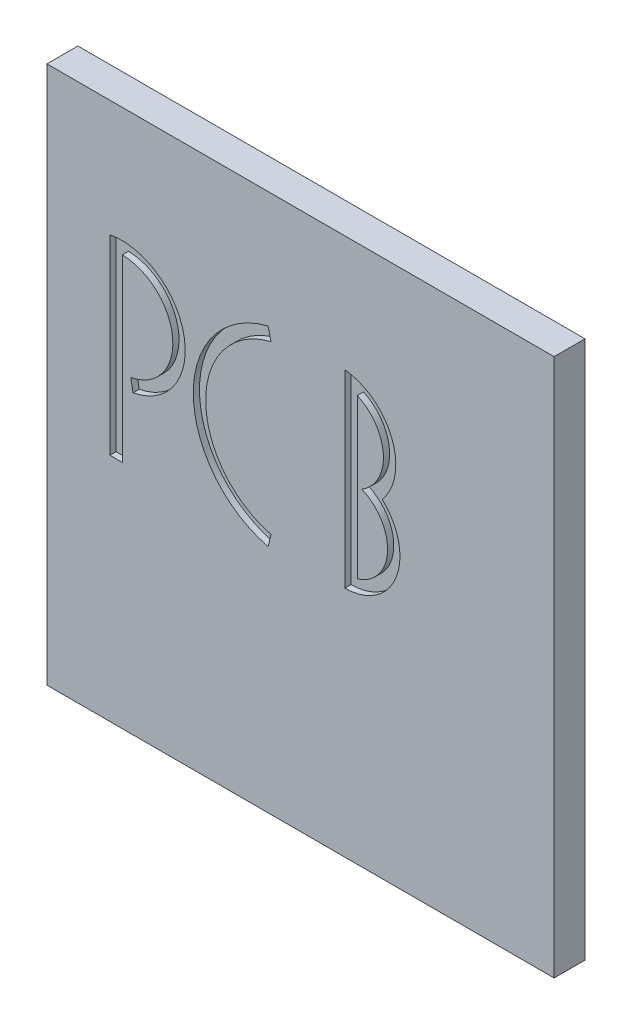
ISO-10303-21;
HEADER;
FILE_DESCRIPTION(('STEP AP214'),'2;1');
FILE_NAME('part.step','',(''),(''),'','','');
FILE_SCHEMA(('AUTOMOTIVE_DESIGN { 1 0 10303 214 1 1 1 1 }'));
ENDSEC;
DATA;
#1=APPLICATION_CONTEXT('core data for automotive mechanical design processes');
#2=APPLICATION_PROTOCOL_DEFINITION('international standard','automotive_design',2000,#1);
#3=PRODUCT_CONTEXT('',#1,'mechanical');
#4=PRODUCT('Part','Part','',(#3));
#5=PRODUCT_RELATED_PRODUCT_CATEGORY('part','',(#4));
#6=PRODUCT_DEFINITION_FORMATION('','',#4);
#7=PRODUCT_DEFINITION_CONTEXT('part definition',#1,'design');
#8=PRODUCT_DEFINITION('design','',#6,#7);
#9=PRODUCT_DEFINITION_SHAPE('','',#8);
#10=(LENGTH_UNIT() NAMED_UNIT(*) SI_UNIT(.MILLI.,.METRE.));
#11=(NAMED_UNIT(*) PLANE_ANGLE_UNIT() SI_UNIT($,.RADIAN.));
#12=(NAMED_UNIT(*) SI_UNIT($,.STERADIAN.) SOLID_ANGLE_UNIT());
#13=UNCERTAINTY_MEASURE_WITH_UNIT(LENGTH_MEASURE(1.E-05),#10,'distance_accuracy_value','');
#14=(GEOMETRIC_REPRESENTATION_CONTEXT(3) GLOBAL_UNCERTAINTY_ASSIGNED_CONTEXT((#13)) GLOBAL_UNIT_ASSIGNED_CONTEXT((#10,
#11,#12)) REPRESENTATION_CONTEXT('',''));
#15=CARTESIAN_POINT('',(0.,0.,0.));
#16=DIRECTION('',(0.,0.,1.));
#17=DIRECTION('',(1.,0.,0.));
#18=AXIS2_PLACEMENT_3D('',#15,#16,#17);
#19=CARTESIAN_POINT('',(-41.,43.5,5.));
#20=DIRECTION('',(1.,0.,0.));
#21=DIRECTION('',(0.,1.,0.));
#22=AXIS2_PLACEMENT_3D('',#19,#20,#21);
#23=PLANE('',#22);
#24=DIRECTION('',(0.,-1.,0.));
#25=VECTOR('',#24,1.);
#26=CARTESIAN_POINT('',(-41.,43.5,0.));
#27=LINE('',#26,#25);
#28=CARTESIAN_POINT('',(-41.,43.5,0.));
#29=VERTEX_POINT('',#28);
#30=CARTESIAN_POINT('',(-41.,-43.5,0.));
#31=VERTEX_POINT('',#30);
#32=EDGE_CURVE('E217',#29,#31,#27,.T.);
#33=ORIENTED_EDGE('',*,*,#32,.T.);
#34=DIRECTION('',(0.,0.,-1.));
#35=VECTOR('',#34,1.);
#36=CARTESIAN_POINT('',(-41.,-43.5,5.));
#37=LINE('',#36,#35);
#38=CARTESIAN_POINT('',(-41.,-43.5,5.));
#39=VERTEX_POINT('',#38);
#40=EDGE_CURVE('E11',#39,#31,#37,.T.);
#41=ORIENTED_EDGE('',*,*,#40,.F.);
#42=DIRECTION('',(0.,-1.,0.));
#43=VECTOR('',#42,1.);
#44=CARTESIAN_POINT('',(-41.,43.5,5.));
#45=LINE('',#44,#43);
#46=CARTESIAN_POINT('',(-41.,43.5,5.));
#47=VERTEX_POINT('',#46);
#48=EDGE_CURVE('E303',#47,#39,#45,.T.);
#49=ORIENTED_EDGE('',*,*,#48,.F.);
#50=DIRECTION('',(0.,0.,-1.));
#51=VECTOR('',#50,1.);
#52=CARTESIAN_POINT('',(-41.,43.5,5.));
#53=LINE('',#52,#51);
#54=EDGE_CURVE('E313',#47,#29,#53,.T.);
#55=ORIENTED_EDGE('',*,*,#54,.T.);
#56=EDGE_LOOP('',(#33,#41,#49,#55));
#57=FACE_BOUND('',#56,.T.);
#58=ADVANCED_FACE('F33',(#57),#23,.F.);
#59=CARTESIAN_POINT('',(41.,-43.5,5.));
#60=DIRECTION('',(0.,1.,0.));
#61=DIRECTION('',(0.,0.,1.));
#62=AXIS2_PLACEMENT_3D('',#59,#60,#61);
#63=PLANE('',#62);
#64=DIRECTION('',(1.,0.,0.));
#65=VECTOR('',#64,1.);
#66=CARTESIAN_POINT('',(41.,-43.5,0.));
#67=LINE('',#66,#65);
#68=CARTESIAN_POINT('',(41.,-43.5,0.));
#69=VERTEX_POINT('',#68);
#70=EDGE_CURVE('E316',#31,#69,#67,.T.);
#71=ORIENTED_EDGE('',*,*,#70,.T.);
#72=DIRECTION('',(0.,0.,-1.));
#73=VECTOR('',#72,1.);
#74=CARTESIAN_POINT('',(41.,-43.5,5.));
#75=LINE('',#74,#73);
#76=CARTESIAN_POINT('',(41.,-43.5,5.));
#77=VERTEX_POINT('',#76);
#78=EDGE_CURVE('E40',#77,#69,#75,.T.);
#79=ORIENTED_EDGE('',*,*,#78,.F.);
#80=DIRECTION('',(1.,0.,0.));
#81=VECTOR('',#80,1.);
#82=CARTESIAN_POINT('',(41.,-43.5,5.));
#83=LINE('',#82,#81);
#84=EDGE_CURVE('E306',#39,#77,#83,.T.);
#85=ORIENTED_EDGE('',*,*,#84,.F.);
#86=ORIENTED_EDGE('',*,*,#40,.T.);
#87=EDGE_LOOP('',(#71,#79,#85,#86));
#88=FACE_BOUND('',#87,.T.);
#89=ADVANCED_FACE('F346',(#88),#63,.F.);
#90=CARTESIAN_POINT('',(41.,43.5,5.));
#91=DIRECTION('',(-1.,0.,0.));
#92=DIRECTION('',(0.,-1.,0.));
#93=AXIS2_PLACEMENT_3D('',#90,#91,#92);
#94=PLANE('',#93);
#95=DIRECTION('',(0.,1.,0.));
#96=VECTOR('',#95,1.);
#97=CARTESIAN_POINT('',(41.,43.5,0.));
#98=LINE('',#97,#96);
#99=CARTESIAN_POINT('',(41.,43.5,0.));
#100=VERTEX_POINT('',#99);
#101=EDGE_CURVE('E318',#69,#100,#98,.T.);
#102=ORIENTED_EDGE('',*,*,#101,.T.);
#103=DIRECTION('',(0.,0.,-1.));
#104=VECTOR('',#103,1.);
#105=CARTESIAN_POINT('',(41.,43.5,5.));
#106=LINE('',#105,#104);
#107=CARTESIAN_POINT('',(41.,43.5,5.));
#108=VERTEX_POINT('',#107);
#109=EDGE_CURVE('E323',#108,#100,#106,.T.);
#110=ORIENTED_EDGE('',*,*,#109,.F.);
#111=DIRECTION('',(0.,1.,0.));
#112=VECTOR('',#111,1.);
#113=CARTESIAN_POINT('',(41.,43.5,5.));
#114=LINE('',#113,#112);
#115=EDGE_CURVE('E309',#77,#108,#114,.T.);
#116=ORIENTED_EDGE('',*,*,#115,.F.);
#117=ORIENTED_EDGE('',*,*,#78,.T.);
#118=EDGE_LOOP('',(#102,#110,#116,#117));
#119=FACE_BOUND('',#118,.T.);
#120=ADVANCED_FACE('F330',(#119),#94,.F.);
#121=CARTESIAN_POINT('',(41.,43.5,5.));
#122=DIRECTION('',(0.,-1.,0.));
#123=DIRECTION('',(1.,0.,0.));
#124=AXIS2_PLACEMENT_3D('',#121,#122,#123);
#125=PLANE('',#124);
#126=DIRECTION('',(-1.,0.,0.));
#127=VECTOR('',#126,1.);
#128=CARTESIAN_POINT('',(41.,43.5,0.));
#129=LINE('',#128,#127);
#130=EDGE_CURVE('E307',#100,#29,#129,.T.);
#131=ORIENTED_EDGE('',*,*,#130,.T.);
#132=ORIENTED_EDGE('',*,*,#54,.F.);
#133=DIRECTION('',(-1.,0.,0.));
#134=VECTOR('',#133,1.);
#135=CARTESIAN_POINT('',(41.,43.5,5.));
#136=LINE('',#135,#134);
#137=EDGE_CURVE('E311',#108,#47,#136,.T.);
#138=ORIENTED_EDGE('',*,*,#137,.F.);
#139=ORIENTED_EDGE('',*,*,#109,.T.);
#140=EDGE_LOOP('',(#131,#132,#138,#139));
#141=FACE_BOUND('',#140,.T.);
#142=ADVANCED_FACE('F339',(#141),#125,.F.);
#143=CARTESIAN_POINT('',(0.,0.,5.));
#144=DIRECTION('',(0.,0.,-1.));
#145=DIRECTION('',(-1.,0.,0.));
#146=AXIS2_PLACEMENT_3D('',#143,#144,#145);
#147=PLANE('',#146);
#148=DIRECTION('',(0.,-1.,0.));
#149=VECTOR('',#148,1.);
#150=CARTESIAN_POINT('',(-30.8207133272117,24.6686335632673,5.));
#151=LINE('',#150,#149);
#152=CARTESIAN_POINT('',(-30.8207133272117,24.6686335632673,5.));
#153=VERTEX_POINT('',#152);
#154=CARTESIAN_POINT('',(-30.8207133272117,-6.21239427143405,5.));
#155=VERTEX_POINT('',#154);
#156=EDGE_CURVE('E204',#153,#155,#151,.T.);
#157=ORIENTED_EDGE('',*,*,#156,.F.);
#158=CARTESIAN_POINT('',(-28.9509635950325,14.5357963050059,5.));
#159=DIRECTION('',(0.,0.,1.));
#160=DIRECTION('',(-1.,0.,0.));
#161=AXIS2_PLACEMENT_3D('',#158,#159,#160);
#162=CIRCLE('',#161,10.3038999880334);
#163=CARTESIAN_POINT('',(-27.0812138628533,4.40295904674455,5.));
#164=VERTEX_POINT('',#163);
#165=EDGE_CURVE('E47',#164,#153,#162,.T.);
#166=ORIENTED_EDGE('',*,*,#165,.F.);
#167=DIRECTION('',(0.181460392118582,-0.98339825406199,0.));
#168=VECTOR('',#167,1.);
#169=CARTESIAN_POINT('',(-27.0812138628533,4.40295904674455,5.));
#170=LINE('',#169,#168);
#171=CARTESIAN_POINT('',(-27.4441346470905,6.36975555486853,5.));
#172=VERTEX_POINT('',#171);
#173=EDGE_CURVE('E190',#172,#164,#170,.T.);
#174=ORIENTED_EDGE('',*,*,#173,.F.);
#175=CARTESIAN_POINT('',(-28.9509635950325,14.5357963050059,5.));
#176=DIRECTION('',(0.,0.,-1.));
#177=DIRECTION('',(-1.,0.,0.));
#178=AXIS2_PLACEMENT_3D('',#175,#176,#177);
#179=CIRCLE('',#178,8.30389998803338);
#180=CARTESIAN_POINT('',(-28.8207133272117,22.8386747142682,5.));
#181=VERTEX_POINT('',#180);
#182=EDGE_CURVE('E193',#181,#172,#179,.T.);
#183=ORIENTED_EDGE('',*,*,#182,.F.);
#184=DIRECTION('',(0.,1.,0.));
#185=VECTOR('',#184,1.);
#186=CARTESIAN_POINT('',(-28.8207133272117,22.8386747142682,5.));
#187=LINE('',#186,#185);
#188=CARTESIAN_POINT('',(-28.8207133272117,-6.21239427143405,5.));
#189=VERTEX_POINT('',#188);
#190=EDGE_CURVE('E210',#189,#181,#187,.T.);
#191=ORIENTED_EDGE('',*,*,#190,.F.);
#192=DIRECTION('',(1.,0.,0.));
#193=VECTOR('',#192,1.);
#194=CARTESIAN_POINT('',(-30.8207133272117,-6.21239427143405,5.));
#195=LINE('',#194,#193);
#196=EDGE_CURVE('E207',#155,#189,#195,.T.);
#197=ORIENTED_EDGE('',*,*,#196,.F.);
#198=EDGE_LOOP('',(#157,#166,#174,#183,#191,#197));
#199=FACE_BOUND('',#198,.T.);
#200=DIRECTION('',(-0.2394805267225,0.970901167637939,0.));
#201=VECTOR('',#200,1.);
#202=CARTESIAN_POINT('',(-5.24736215159964,24.6686335632673,5.));
#203=LINE('',#202,#201);
#204=CARTESIAN_POINT('',(-4.76840109815464,22.7268312279914,5.));
#205=VERTEX_POINT('',#204);
#206=CARTESIAN_POINT('',(-5.24736215159964,24.6686335632673,5.));
#207=VERTEX_POINT('',#206);
#208=EDGE_CURVE('E240',#205,#207,#203,.T.);
#209=ORIENTED_EDGE('',*,*,#208,.F.);
#210=CARTESIAN_POINT('',(-1.43883608422534,9.22811964591664,5.));
#211=DIRECTION('',(0.,0.,-1.));
#212=DIRECTION('',(-1.,0.,0.));
#213=AXIS2_PLACEMENT_3D('',#210,#211,#212);
#214=CIRCLE('',#213,13.9032808199368);
#215=CARTESIAN_POINT('',(-4.76840109815465,-4.27059193615817,5.));
#216=VERTEX_POINT('',#215);
#217=EDGE_CURVE('E55',#216,#205,#214,.T.);
#218=ORIENTED_EDGE('',*,*,#217,.F.);
#219=DIRECTION('',(0.239480526722495,0.970901167637941,0.));
#220=VECTOR('',#219,1.);
#221=CARTESIAN_POINT('',(-5.24736215159964,-6.21239427143405,5.));
#222=LINE('',#221,#220);
#223=CARTESIAN_POINT('',(-5.24736215159964,-6.21239427143405,5.));
#224=VERTEX_POINT('',#223);
#225=EDGE_CURVE('E229',#224,#216,#222,.T.);
#226=ORIENTED_EDGE('',*,*,#225,.F.);
#227=CARTESIAN_POINT('',(-1.43883608422534,9.22811964591664,5.));
#228=DIRECTION('',(0.,0.,1.));
#229=DIRECTION('',(-1.,0.,0.));
#230=AXIS2_PLACEMENT_3D('',#227,#228,#229);
#231=CIRCLE('',#230,15.9032808199368);
#232=EDGE_CURVE('E244',#207,#224,#231,.T.);
#233=ORIENTED_EDGE('',*,*,#232,.F.);
#234=EDGE_LOOP('',(#209,#218,#226,#233));
#235=FACE_BOUND('',#234,.T.);
#236=DIRECTION('',(0.,-1.,0.));
#237=VECTOR('',#236,1.);
#238=CARTESIAN_POINT('',(7.17742639126848,24.7531190956433,5.));
#239=LINE('',#238,#237);
#240=CARTESIAN_POINT('',(7.17742639126848,24.7531190956433,5.));
#241=VERTEX_POINT('',#240);
#242=CARTESIAN_POINT('',(7.17742639126848,-5.82223480111038,5.));
#243=VERTEX_POINT('',#242);
#244=EDGE_CURVE('E293',#241,#243,#239,.T.);
#245=ORIENTED_EDGE('',*,*,#244,.F.);
#246=CARTESIAN_POINT('',(6.18000906247459,15.5864041945769,5.));
#247=DIRECTION('',(0.,0.,1.));
#248=DIRECTION('',(1.,0.,0.));
#249=AXIS2_PLACEMENT_3D('',#246,#247,#248);
#250=CIRCLE('',#249,9.22081902030456);
#251=CARTESIAN_POINT('',(13.2088771402336,9.61827911624031,5.));
#252=VERTEX_POINT('',#251);
#253=EDGE_CURVE('E276',#252,#241,#250,.T.);
#254=ORIENTED_EDGE('',*,*,#253,.F.);
#255=CARTESIAN_POINT('',(7.17742639126848,3.07603988197222,5.));
#256=DIRECTION('',(0.,0.,1.));
#257=DIRECTION('',(1.,0.,0.));
#258=AXIS2_PLACEMENT_3D('',#255,#256,#257);
#259=CIRCLE('',#258,8.8982746830826);
#260=EDGE_CURVE('E285',#243,#252,#259,.T.);
#261=ORIENTED_EDGE('',*,*,#260,.F.);
#262=EDGE_LOOP('',(#245,#254,#261));
#263=FACE_BOUND('',#262,.T.);
#264=ORIENTED_EDGE('',*,*,#48,.T.);
#265=ORIENTED_EDGE('',*,*,#84,.T.);
#266=ORIENTED_EDGE('',*,*,#115,.T.);
#267=ORIENTED_EDGE('',*,*,#137,.T.);
#268=EDGE_LOOP('',(#264,#265,#266,#267));
#269=FACE_BOUND('',#268,.T.);
#270=ADVANCED_FACE('F345',(#199,#235,#263,#269),#147,.F.);
#271=CARTESIAN_POINT('',(0.,0.,0.));
#272=DIRECTION('',(0.,0.,-1.));
#273=DIRECTION('',(-1.,0.,0.));
#274=AXIS2_PLACEMENT_3D('',#271,#272,#273);
#275=PLANE('',#274);
#276=ORIENTED_EDGE('',*,*,#32,.F.);
#277=ORIENTED_EDGE('',*,*,#130,.F.);
#278=ORIENTED_EDGE('',*,*,#101,.F.);
#279=ORIENTED_EDGE('',*,*,#70,.F.);
#280=EDGE_LOOP('',(#276,#277,#278,#279));
#281=FACE_BOUND('',#280,.T.);
#282=ADVANCED_FACE('F336',(#281),#275,.T.);
#283=CARTESIAN_POINT('',(6.18000906247459,15.5864041945769,4.));
#284=DIRECTION('',(0.,0.,1.));
#285=DIRECTION('',(1.,0.,0.));
#286=AXIS2_PLACEMENT_3D('',#283,#284,#285);
#287=CYLINDRICAL_SURFACE('',#286,9.22081902030456);
#288=ORIENTED_EDGE('',*,*,#253,.T.);
#289=DIRECTION('',(0.,0.,1.));
#290=VECTOR('',#289,1.);
#291=CARTESIAN_POINT('',(7.17742639126848,24.7531190956433,4.));
#292=LINE('',#291,#290);
#293=CARTESIAN_POINT('',(7.17742639126848,24.7531190956433,4.));
#294=VERTEX_POINT('',#293);
#295=EDGE_CURVE('E291',#294,#241,#292,.T.);
#296=ORIENTED_EDGE('',*,*,#295,.F.);
#297=CARTESIAN_POINT('',(6.18000906247459,15.5864041945769,4.));
#298=DIRECTION('',(0.,0.,1.));
#299=DIRECTION('',(1.,0.,0.));
#300=AXIS2_PLACEMENT_3D('',#297,#298,#299);
#301=CIRCLE('',#300,9.22081902030456);
#302=CARTESIAN_POINT('',(13.2088771402336,9.61827911624031,4.));
#303=VERTEX_POINT('',#302);
#304=EDGE_CURVE('E281',#303,#294,#301,.T.);
#305=ORIENTED_EDGE('',*,*,#304,.F.);
#306=DIRECTION('',(0.,0.,1.));
#307=VECTOR('',#306,1.);
#308=CARTESIAN_POINT('',(13.2088771402336,9.61827911624031,4.));
#309=LINE('',#308,#307);
#310=EDGE_CURVE('E241',#303,#252,#309,.T.);
#311=ORIENTED_EDGE('',*,*,#310,.T.);
#312=EDGE_LOOP('',(#288,#296,#305,#311));
#313=FACE_BOUND('',#312,.T.);
#314=ADVANCED_FACE('F358',(#313),#287,.F.);
#315=CARTESIAN_POINT('',(7.17742639126848,3.07603988197222,4.));
#316=DIRECTION('',(0.,0.,1.));
#317=DIRECTION('',(1.,0.,0.));
#318=AXIS2_PLACEMENT_3D('',#315,#316,#317);
#319=CYLINDRICAL_SURFACE('',#318,8.8982746830826);
#320=ORIENTED_EDGE('',*,*,#260,.T.);
#321=ORIENTED_EDGE('',*,*,#310,.F.);
#322=CARTESIAN_POINT('',(7.17742639126848,3.07603988197222,4.));
#323=DIRECTION('',(0.,0.,1.));
#324=DIRECTION('',(1.,0.,0.));
#325=AXIS2_PLACEMENT_3D('',#322,#323,#324);
#326=CIRCLE('',#325,8.8982746830826);
#327=CARTESIAN_POINT('',(7.17742639126848,-5.82223480111038,4.));
#328=VERTEX_POINT('',#327);
#329=EDGE_CURVE('E288',#328,#303,#326,.T.);
#330=ORIENTED_EDGE('',*,*,#329,.F.);
#331=DIRECTION('',(0.,0.,1.));
#332=VECTOR('',#331,1.);
#333=CARTESIAN_POINT('',(7.17742639126848,-5.82223480111038,4.));
#334=LINE('',#333,#332);
#335=EDGE_CURVE('E299',#328,#243,#334,.T.);
#336=ORIENTED_EDGE('',*,*,#335,.T.);
#337=EDGE_LOOP('',(#320,#321,#330,#336));
#338=FACE_BOUND('',#337,.T.);
#339=ADVANCED_FACE('F365',(#338),#319,.F.);
#340=CARTESIAN_POINT('',(7.17742639126848,24.7531190956433,4.));
#341=DIRECTION('',(-1.,0.,0.));
#342=DIRECTION('',(0.,0.,1.));
#343=AXIS2_PLACEMENT_3D('',#340,#341,#342);
#344=PLANE('',#343);
#345=ORIENTED_EDGE('',*,*,#244,.T.);
#346=ORIENTED_EDGE('',*,*,#335,.F.);
#347=DIRECTION('',(0.,-1.,0.));
#348=VECTOR('',#347,1.);
#349=CARTESIAN_POINT('',(7.17742639126848,24.7531190956433,4.));
#350=LINE('',#349,#348);
#351=EDGE_CURVE('E284',#294,#328,#350,.T.);
#352=ORIENTED_EDGE('',*,*,#351,.F.);
#353=ORIENTED_EDGE('',*,*,#295,.T.);
#354=EDGE_LOOP('',(#345,#346,#352,#353));
#355=FACE_BOUND('',#354,.T.);
#356=ADVANCED_FACE('F367',(#355),#344,.F.);
#357=CARTESIAN_POINT('',(6.18000906247459,15.5864041945769,4.));
#358=DIRECTION('',(0.,0.,1.));
#359=DIRECTION('',(1.,0.,0.));
#360=AXIS2_PLACEMENT_3D('',#357,#358,#359);
#361=PLANE('',#360);
#362=DIRECTION('',(0.,-1.,0.));
#363=VECTOR('',#362,1.);
#364=CARTESIAN_POINT('',(9.17742639126848,22.1557052746796,4.));
#365=LINE('',#364,#363);
#366=CARTESIAN_POINT('',(9.17742639126847,22.1557052746796,4.));
#367=VERTEX_POINT('',#366);
#368=CARTESIAN_POINT('',(9.17742639126848,-3.52594418369003,4.));
#369=VERTEX_POINT('',#368);
#370=EDGE_CURVE('E262',#367,#369,#365,.T.);
#371=ORIENTED_EDGE('',*,*,#370,.F.);
#372=CARTESIAN_POINT('',(6.18000906247459,15.5864041945769,4.));
#373=DIRECTION('',(0.,0.,1.));
#374=DIRECTION('',(1.,0.,0.));
#375=AXIS2_PLACEMENT_3D('',#372,#373,#374);
#376=CIRCLE('',#375,7.22081902030456);
#377=CARTESIAN_POINT('',(9.91621739592894,9.40732864778044,4.));
#378=VERTEX_POINT('',#377);
#379=EDGE_CURVE('E258',#378,#367,#376,.T.);
#380=ORIENTED_EDGE('',*,*,#379,.F.);
#381=CARTESIAN_POINT('',(7.17742639126848,3.07603988197222,4.));
#382=DIRECTION('',(0.,0.,1.));
#383=DIRECTION('',(1.,0.,0.));
#384=AXIS2_PLACEMENT_3D('',#381,#382,#383);
#385=CIRCLE('',#384,6.8982746830826);
#386=EDGE_CURVE('E255',#369,#378,#385,.T.);
#387=ORIENTED_EDGE('',*,*,#386,.F.);
#388=EDGE_LOOP('',(#371,#380,#387));
#389=FACE_BOUND('',#388,.T.);
#390=ORIENTED_EDGE('',*,*,#304,.T.);
#391=ORIENTED_EDGE('',*,*,#351,.T.);
#392=ORIENTED_EDGE('',*,*,#329,.T.);
#393=EDGE_LOOP('',(#390,#391,#392));
#394=FACE_BOUND('',#393,.T.);
#395=ADVANCED_FACE('F370',(#389,#394),#361,.T.);
#396=CARTESIAN_POINT('',(7.17742639126848,3.07603988197222,4.));
#397=DIRECTION('',(0.,0.,1.));
#398=DIRECTION('',(1.,0.,0.));
#399=AXIS2_PLACEMENT_3D('',#396,#397,#398);
#400=CYLINDRICAL_SURFACE('',#399,6.8982746830826);
#401=CARTESIAN_POINT('',(7.17742639126848,3.07603988197222,5.));
#402=DIRECTION('',(0.,0.,1.));
#403=DIRECTION('',(1.,0.,0.));
#404=AXIS2_PLACEMENT_3D('',#401,#402,#403);
#405=CIRCLE('',#404,6.8982746830826);
#406=CARTESIAN_POINT('',(9.17742639126848,-3.52594418369003,5.));
#407=VERTEX_POINT('',#406);
#408=CARTESIAN_POINT('',(9.91621739592894,9.40732864778044,5.));
#409=VERTEX_POINT('',#408);
#410=EDGE_CURVE('E266',#407,#409,#405,.T.);
#411=ORIENTED_EDGE('',*,*,#410,.F.);
#412=DIRECTION('',(0.,0.,1.));
#413=VECTOR('',#412,1.);
#414=CARTESIAN_POINT('',(9.17742639126848,-3.52594418369003,4.));
#415=LINE('',#414,#413);
#416=EDGE_CURVE('E274',#369,#407,#415,.T.);
#417=ORIENTED_EDGE('',*,*,#416,.F.);
#418=ORIENTED_EDGE('',*,*,#386,.T.);
#419=DIRECTION('',(0.,0.,1.));
#420=VECTOR('',#419,1.);
#421=CARTESIAN_POINT('',(9.91621739592894,9.40732864778044,4.));
#422=LINE('',#421,#420);
#423=EDGE_CURVE('E265',#378,#409,#422,.T.);
#424=ORIENTED_EDGE('',*,*,#423,.T.);
#425=EDGE_LOOP('',(#411,#417,#418,#424));
#426=FACE_BOUND('',#425,.T.);
#427=ADVANCED_FACE('F377',(#426),#400,.T.);
#428=CARTESIAN_POINT('',(9.17742639126848,22.1557052746796,4.));
#429=DIRECTION('',(-1.,0.,0.));
#430=DIRECTION('',(0.,0.,1.));
#431=AXIS2_PLACEMENT_3D('',#428,#429,#430);
#432=PLANE('',#431);
#433=DIRECTION('',(0.,-1.,0.));
#434=VECTOR('',#433,1.);
#435=CARTESIAN_POINT('',(9.17742639126848,22.1557052746796,5.));
#436=LINE('',#435,#434);
#437=CARTESIAN_POINT('',(9.17742639126847,22.1557052746796,5.));
#438=VERTEX_POINT('',#437);
#439=EDGE_CURVE('E259',#438,#407,#436,.T.);
#440=ORIENTED_EDGE('',*,*,#439,.F.);
#441=DIRECTION('',(0.,0.,1.));
#442=VECTOR('',#441,1.);
#443=CARTESIAN_POINT('',(9.17742639126847,22.1557052746796,4.));
#444=LINE('',#443,#442);
#445=EDGE_CURVE('E277',#367,#438,#444,.T.);
#446=ORIENTED_EDGE('',*,*,#445,.F.);
#447=ORIENTED_EDGE('',*,*,#370,.T.);
#448=ORIENTED_EDGE('',*,*,#416,.T.);
#449=EDGE_LOOP('',(#440,#446,#447,#448));
#450=FACE_BOUND('',#449,.T.);
#451=ADVANCED_FACE('F381',(#450),#432,.T.);
#452=CARTESIAN_POINT('',(6.18000906247459,15.5864041945769,4.));
#453=DIRECTION('',(0.,0.,1.));
#454=DIRECTION('',(1.,0.,0.));
#455=AXIS2_PLACEMENT_3D('',#452,#453,#454);
#456=CYLINDRICAL_SURFACE('',#455,7.22081902030456);
#457=CARTESIAN_POINT('',(6.18000906247459,15.5864041945769,5.));
#458=DIRECTION('',(0.,0.,1.));
#459=DIRECTION('',(1.,0.,0.));
#460=AXIS2_PLACEMENT_3D('',#457,#458,#459);
#461=CIRCLE('',#460,7.22081902030456);
#462=EDGE_CURVE('E269',#409,#438,#461,.T.);
#463=ORIENTED_EDGE('',*,*,#462,.F.);
#464=ORIENTED_EDGE('',*,*,#423,.F.);
#465=ORIENTED_EDGE('',*,*,#379,.T.);
#466=ORIENTED_EDGE('',*,*,#445,.T.);
#467=EDGE_LOOP('',(#463,#464,#465,#466));
#468=FACE_BOUND('',#467,.T.);
#469=ADVANCED_FACE('F383',(#468),#456,.T.);
#470=CARTESIAN_POINT('',(-1.43883608422534,9.22811964591664,4.));
#471=DIRECTION('',(0.,0.,1.));
#472=DIRECTION('',(1.,0.,0.));
#473=AXIS2_PLACEMENT_3D('',#470,#471,#472);
#474=CYLINDRICAL_SURFACE('',#473,13.9032808199368);
#475=ORIENTED_EDGE('',*,*,#217,.T.);
#476=DIRECTION('',(0.,0.,1.));
#477=VECTOR('',#476,1.);
#478=CARTESIAN_POINT('',(-4.76840109815464,22.7268312279914,4.));
#479=LINE('',#478,#477);
#480=CARTESIAN_POINT('',(-4.76840109815464,22.7268312279914,4.));
#481=VERTEX_POINT('',#480);
#482=EDGE_CURVE('E238',#481,#205,#479,.T.);
#483=ORIENTED_EDGE('',*,*,#482,.F.);
#484=CARTESIAN_POINT('',(-1.43883608422534,9.22811964591664,4.));
#485=DIRECTION('',(0.,0.,-1.));
#486=DIRECTION('',(-1.,0.,0.));
#487=AXIS2_PLACEMENT_3D('',#484,#485,#486);
#488=CIRCLE('',#487,13.9032808199368);
#489=CARTESIAN_POINT('',(-4.76840109815465,-4.27059193615817,4.));
#490=VERTEX_POINT('',#489);
#491=EDGE_CURVE('E225',#490,#481,#488,.T.);
#492=ORIENTED_EDGE('',*,*,#491,.F.);
#493=DIRECTION('',(0.,0.,1.));
#494=VECTOR('',#493,1.);
#495=CARTESIAN_POINT('',(-4.76840109815465,-4.27059193615817,4.));
#496=LINE('',#495,#494);
#497=EDGE_CURVE('E205',#490,#216,#496,.T.);
#498=ORIENTED_EDGE('',*,*,#497,.T.);
#499=EDGE_LOOP('',(#475,#483,#492,#498));
#500=FACE_BOUND('',#499,.T.);
#501=ADVANCED_FACE('F386',(#500),#474,.T.);
#502=CARTESIAN_POINT('',(-5.24736215159964,-6.21239427143405,4.));
#503=DIRECTION('',(0.970901167637941,-0.239480526722495,0.));
#504=DIRECTION('',(0.239480526722495,0.970901167637941,0.));
#505=AXIS2_PLACEMENT_3D('',#502,#503,#504);
#506=PLANE('',#505);
#507=ORIENTED_EDGE('',*,*,#225,.T.);
#508=ORIENTED_EDGE('',*,*,#497,.F.);
#509=DIRECTION('',(0.239480526722495,0.970901167637941,0.));
#510=VECTOR('',#509,1.);
#511=CARTESIAN_POINT('',(-5.24736215159964,-6.21239427143405,4.));
#512=LINE('',#511,#510);
#513=CARTESIAN_POINT('',(-5.24736215159964,-6.21239427143405,4.));
#514=VERTEX_POINT('',#513);
#515=EDGE_CURVE('E235',#514,#490,#512,.T.);
#516=ORIENTED_EDGE('',*,*,#515,.F.);
#517=DIRECTION('',(0.,0.,1.));
#518=VECTOR('',#517,1.);
#519=CARTESIAN_POINT('',(-5.24736215159964,-6.21239427143405,4.));
#520=LINE('',#519,#518);
#521=EDGE_CURVE('E250',#514,#224,#520,.T.);
#522=ORIENTED_EDGE('',*,*,#521,.T.);
#523=EDGE_LOOP('',(#507,#508,#516,#522));
#524=FACE_BOUND('',#523,.T.);
#525=ADVANCED_FACE('F393',(#524),#506,.F.);
#526=CARTESIAN_POINT('',(-1.43883608422534,9.22811964591664,4.));
#527=DIRECTION('',(0.,0.,1.));
#528=DIRECTION('',(1.,0.,0.));
#529=AXIS2_PLACEMENT_3D('',#526,#527,#528);
#530=CYLINDRICAL_SURFACE('',#529,15.9032808199368);
#531=ORIENTED_EDGE('',*,*,#232,.T.);
#532=ORIENTED_EDGE('',*,*,#521,.F.);
#533=CARTESIAN_POINT('',(-1.43883608422534,9.22811964591664,4.));
#534=DIRECTION('',(0.,0.,1.));
#535=DIRECTION('',(-1.,0.,0.));
#536=AXIS2_PLACEMENT_3D('',#533,#534,#535);
#537=CIRCLE('',#536,15.9032808199368);
#538=CARTESIAN_POINT('',(-5.24736215159964,24.6686335632673,4.));
#539=VERTEX_POINT('',#538);
#540=EDGE_CURVE('E232',#539,#514,#537,.T.);
#541=ORIENTED_EDGE('',*,*,#540,.F.);
#542=DIRECTION('',(0.,0.,1.));
#543=VECTOR('',#542,1.);
#544=CARTESIAN_POINT('',(-5.24736215159964,24.6686335632673,4.));
#545=LINE('',#544,#543);
#546=EDGE_CURVE('E252',#539,#207,#545,.T.);
#547=ORIENTED_EDGE('',*,*,#546,.T.);
#548=EDGE_LOOP('',(#531,#532,#541,#547));
#549=FACE_BOUND('',#548,.T.);
#550=ADVANCED_FACE('F398',(#549),#530,.F.);
#551=CARTESIAN_POINT('',(-5.24736215159964,24.6686335632673,4.));
#552=DIRECTION('',(0.970901167637939,0.2394805267225,0.));
#553=DIRECTION('',(-0.2394805267225,0.970901167637939,0.));
#554=AXIS2_PLACEMENT_3D('',#551,#552,#553);
#555=PLANE('',#554);
#556=ORIENTED_EDGE('',*,*,#208,.T.);
#557=ORIENTED_EDGE('',*,*,#546,.F.);
#558=DIRECTION('',(-0.2394805267225,0.970901167637939,0.));
#559=VECTOR('',#558,1.);
#560=CARTESIAN_POINT('',(-5.24736215159964,24.6686335632673,4.));
#561=LINE('',#560,#559);
#562=EDGE_CURVE('E228',#481,#539,#561,.T.);
#563=ORIENTED_EDGE('',*,*,#562,.F.);
#564=ORIENTED_EDGE('',*,*,#482,.T.);
#565=EDGE_LOOP('',(#556,#557,#563,#564));
#566=FACE_BOUND('',#565,.T.);
#567=ADVANCED_FACE('F394',(#566),#555,.F.);
#568=CARTESIAN_POINT('',(-1.43883608422534,9.22811964591664,4.));
#569=DIRECTION('',(0.,0.,-1.));
#570=DIRECTION('',(-1.,0.,0.));
#571=AXIS2_PLACEMENT_3D('',#568,#569,#570);
#572=PLANE('',#571);
#573=ORIENTED_EDGE('',*,*,#491,.T.);
#574=ORIENTED_EDGE('',*,*,#562,.T.);
#575=ORIENTED_EDGE('',*,*,#540,.T.);
#576=ORIENTED_EDGE('',*,*,#515,.T.);
#577=EDGE_LOOP('',(#573,#574,#575,#576));
#578=FACE_BOUND('',#577,.T.);
#579=ADVANCED_FACE('F397',(#578),#572,.F.);
#580=CARTESIAN_POINT('',(-28.9509635950325,14.5357963050059,4.));
#581=DIRECTION('',(0.,0.,1.));
#582=DIRECTION('',(1.,0.,0.));
#583=AXIS2_PLACEMENT_3D('',#580,#581,#582);
#584=CYLINDRICAL_SURFACE('',#583,10.3038999880334);
#585=ORIENTED_EDGE('',*,*,#165,.T.);
#586=DIRECTION('',(0.,0.,1.));
#587=VECTOR('',#586,1.);
#588=CARTESIAN_POINT('',(-30.8207133272117,24.6686335632673,4.));
#589=LINE('',#588,#587);
#590=CARTESIAN_POINT('',(-30.8207133272117,24.6686335632673,4.));
#591=VERTEX_POINT('',#590);
#592=EDGE_CURVE('E167',#591,#153,#589,.T.);
#593=ORIENTED_EDGE('',*,*,#592,.F.);
#594=CARTESIAN_POINT('',(-28.9509635950325,14.5357963050059,4.));
#595=DIRECTION('',(0.,0.,1.));
#596=DIRECTION('',(-1.,0.,0.));
#597=AXIS2_PLACEMENT_3D('',#594,#595,#596);
#598=CIRCLE('',#597,10.3038999880334);
#599=CARTESIAN_POINT('',(-27.0812138628533,4.40295904674455,4.));
#600=VERTEX_POINT('',#599);
#601=EDGE_CURVE('E171',#600,#591,#598,.T.);
#602=ORIENTED_EDGE('',*,*,#601,.F.);
#603=DIRECTION('',(0.,0.,1.));
#604=VECTOR('',#603,1.);
#605=CARTESIAN_POINT('',(-27.0812138628533,4.40295904674455,4.));
#606=LINE('',#605,#604);
#607=EDGE_CURVE('E215',#600,#164,#606,.T.);
#608=ORIENTED_EDGE('',*,*,#607,.T.);
#609=EDGE_LOOP('',(#585,#593,#602,#608));
#610=FACE_BOUND('',#609,.T.);
#611=ADVANCED_FACE('F169',(#610),#584,.F.);
#612=CARTESIAN_POINT('',(-27.0812138628533,4.40295904674455,4.));
#613=DIRECTION('',(-0.98339825406199,-0.181460392118582,0.));
#614=DIRECTION('',(0.181460392118582,-0.98339825406199,0.));
#615=AXIS2_PLACEMENT_3D('',#612,#613,#614);
#616=PLANE('',#615);
#617=ORIENTED_EDGE('',*,*,#173,.T.);
#618=ORIENTED_EDGE('',*,*,#607,.F.);
#619=DIRECTION('',(0.181460392118582,-0.98339825406199,0.));
#620=VECTOR('',#619,1.);
#621=CARTESIAN_POINT('',(-27.0812138628533,4.40295904674455,4.));
#622=LINE('',#621,#620);
#623=CARTESIAN_POINT('',(-27.4441346470905,6.36975555486853,4.));
#624=VERTEX_POINT('',#623);
#625=EDGE_CURVE('E177',#624,#600,#622,.T.);
#626=ORIENTED_EDGE('',*,*,#625,.F.);
#627=DIRECTION('',(0.,0.,1.));
#628=VECTOR('',#627,1.);
#629=CARTESIAN_POINT('',(-27.4441346470905,6.36975555486853,4.));
#630=LINE('',#629,#628);
#631=EDGE_CURVE('E218',#624,#172,#630,.T.);
#632=ORIENTED_EDGE('',*,*,#631,.T.);
#633=EDGE_LOOP('',(#617,#618,#626,#632));
#634=FACE_BOUND('',#633,.T.);
#635=ADVANCED_FACE('F411',(#634),#616,.F.);
#636=CARTESIAN_POINT('',(-28.9509635950325,14.5357963050059,4.));
#637=DIRECTION('',(0.,0.,1.));
#638=DIRECTION('',(1.,0.,0.));
#639=AXIS2_PLACEMENT_3D('',#636,#637,#638);
#640=CYLINDRICAL_SURFACE('',#639,8.30389998803338);
#641=ORIENTED_EDGE('',*,*,#182,.T.);
#642=ORIENTED_EDGE('',*,*,#631,.F.);
#643=CARTESIAN_POINT('',(-28.9509635950325,14.5357963050059,4.));
#644=DIRECTION('',(0.,0.,-1.));
#645=DIRECTION('',(-1.,0.,0.));
#646=AXIS2_PLACEMENT_3D('',#643,#644,#645);
#647=CIRCLE('',#646,8.30389998803338);
#648=CARTESIAN_POINT('',(-28.8207133272117,22.8386747142682,4.));
#649=VERTEX_POINT('',#648);
#650=EDGE_CURVE('E200',#649,#624,#647,.T.);
#651=ORIENTED_EDGE('',*,*,#650,.F.);
#652=DIRECTION('',(0.,0.,1.));
#653=VECTOR('',#652,1.);
#654=CARTESIAN_POINT('',(-28.8207133272117,22.8386747142682,4.));
#655=LINE('',#654,#653);
#656=EDGE_CURVE('E220',#649,#181,#655,.T.);
#657=ORIENTED_EDGE('',*,*,#656,.T.);
#658=EDGE_LOOP('',(#641,#642,#651,#657));
#659=FACE_BOUND('',#658,.T.);
#660=ADVANCED_FACE('F421',(#659),#640,.T.);
#661=CARTESIAN_POINT('',(-28.8207133272117,22.8386747142682,4.));
#662=DIRECTION('',(1.,0.,0.));
#663=DIRECTION('',(0.,0.,-1.));
#664=AXIS2_PLACEMENT_3D('',#661,#662,#663);
#665=PLANE('',#664);
#666=ORIENTED_EDGE('',*,*,#190,.T.);
#667=ORIENTED_EDGE('',*,*,#656,.F.);
#668=DIRECTION('',(0.,1.,0.));
#669=VECTOR('',#668,1.);
#670=CARTESIAN_POINT('',(-28.8207133272117,22.8386747142682,4.));
#671=LINE('',#670,#669);
#672=CARTESIAN_POINT('',(-28.8207133272117,-6.21239427143405,4.));
#673=VERTEX_POINT('',#672);
#674=EDGE_CURVE('E197',#673,#649,#671,.T.);
#675=ORIENTED_EDGE('',*,*,#674,.F.);
#676=DIRECTION('',(0.,0.,1.));
#677=VECTOR('',#676,1.);
#678=CARTESIAN_POINT('',(-28.8207133272117,-6.21239427143405,4.));
#679=LINE('',#678,#677);
#680=EDGE_CURVE('E222',#673,#189,#679,.T.);
#681=ORIENTED_EDGE('',*,*,#680,.T.);
#682=EDGE_LOOP('',(#666,#667,#675,#681));
#683=FACE_BOUND('',#682,.T.);
#684=ADVANCED_FACE('F417',(#683),#665,.F.);
#685=CARTESIAN_POINT('',(-30.8207133272117,-6.21239427143405,4.));
#686=DIRECTION('',(0.,-1.,0.));
#687=DIRECTION('',(0.,0.,-1.));
#688=AXIS2_PLACEMENT_3D('',#685,#686,#687);
#689=PLANE('',#688);
#690=ORIENTED_EDGE('',*,*,#196,.T.);
#691=ORIENTED_EDGE('',*,*,#680,.F.);
#692=DIRECTION('',(1.,0.,0.));
#693=VECTOR('',#692,1.);
#694=CARTESIAN_POINT('',(-30.8207133272117,-6.21239427143405,4.));
#695=LINE('',#694,#693);
#696=CARTESIAN_POINT('',(-30.8207133272117,-6.21239427143405,4.));
#697=VERTEX_POINT('',#696);
#698=EDGE_CURVE('E185',#697,#673,#695,.T.);
#699=ORIENTED_EDGE('',*,*,#698,.F.);
#700=DIRECTION('',(0.,0.,1.));
#701=VECTOR('',#700,1.);
#702=CARTESIAN_POINT('',(-30.8207133272117,-6.21239427143405,4.));
#703=LINE('',#702,#701);
#704=EDGE_CURVE('E176',#697,#155,#703,.T.);
#705=ORIENTED_EDGE('',*,*,#704,.T.);
#706=EDGE_LOOP('',(#690,#691,#699,#705));
#707=FACE_BOUND('',#706,.T.);
#708=ADVANCED_FACE('F414',(#707),#689,.F.);
#709=CARTESIAN_POINT('',(-30.8207133272117,24.6686335632673,4.));
#710=DIRECTION('',(-1.,0.,0.));
#711=DIRECTION('',(0.,0.,1.));
#712=AXIS2_PLACEMENT_3D('',#709,#710,#711);
#713=PLANE('',#712);
#714=ORIENTED_EDGE('',*,*,#156,.T.);
#715=ORIENTED_EDGE('',*,*,#704,.F.);
#716=DIRECTION('',(0.,-1.,0.));
#717=VECTOR('',#716,1.);
#718=CARTESIAN_POINT('',(-30.8207133272117,24.6686335632673,4.));
#719=LINE('',#718,#717);
#720=EDGE_CURVE('E180',#591,#697,#719,.T.);
#721=ORIENTED_EDGE('',*,*,#720,.F.);
#722=ORIENTED_EDGE('',*,*,#592,.T.);
#723=EDGE_LOOP('',(#714,#715,#721,#722));
#724=FACE_BOUND('',#723,.T.);
#725=ADVANCED_FACE('F181',(#724),#713,.F.);
#726=CARTESIAN_POINT('',(-28.9509635950325,14.5357963050059,4.));
#727=DIRECTION('',(0.,0.,-1.));
#728=DIRECTION('',(-1.,0.,0.));
#729=AXIS2_PLACEMENT_3D('',#726,#727,#728);
#730=PLANE('',#729);
#731=ORIENTED_EDGE('',*,*,#601,.T.);
#732=ORIENTED_EDGE('',*,*,#720,.T.);
#733=ORIENTED_EDGE('',*,*,#698,.T.);
#734=ORIENTED_EDGE('',*,*,#674,.T.);
#735=ORIENTED_EDGE('',*,*,#650,.T.);
#736=ORIENTED_EDGE('',*,*,#625,.T.);
#737=EDGE_LOOP('',(#731,#732,#733,#734,#735,#736));
#738=FACE_BOUND('',#737,.T.);
#739=ADVANCED_FACE('F187',(#738),#730,.F.);
#740=ORIENTED_EDGE('',*,*,#410,.T.);
#741=ORIENTED_EDGE('',*,*,#462,.T.);
#742=ORIENTED_EDGE('',*,*,#439,.T.);
#743=EDGE_LOOP('',(#740,#741,#742));
#744=FACE_BOUND('',#743,.T.);
#745=ADVANCED_FACE('F362',(#744),#147,.F.);
#746=CLOSED_SHELL('',(#58,#89,#120,#142,#270,#282,#314,#339,#356,#395,#427,#451,#469,#501,#525,
#550,#567,#579,#611,#635,#660,#684,#708,#725,#739,#745));
#747=MANIFOLD_SOLID_BREP('B2',#746);
#748=ADVANCED_BREP_SHAPE_REPRESENTATION('',(#18,#747),#14);
#749=SHAPE_DEFINITION_REPRESENTATION(#9,#748);
ENDSEC;
END-ISO-10303-21;
